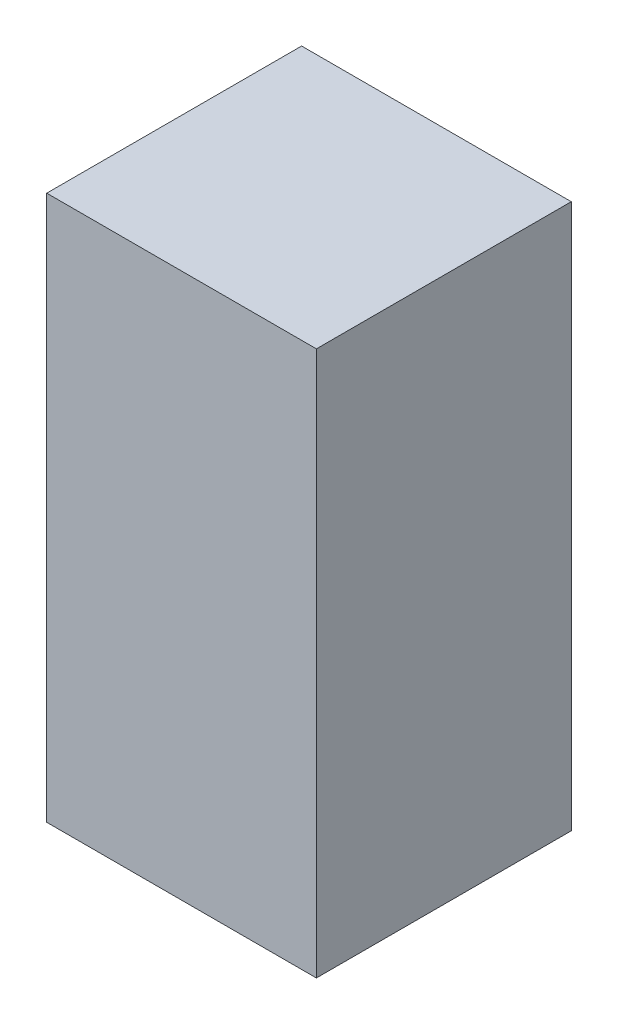
ISO-10303-21;
HEADER;
FILE_DESCRIPTION(('STEP AP214'),'2;1');
FILE_NAME('part.step','',(''),(''),'','','');
FILE_SCHEMA(('AUTOMOTIVE_DESIGN { 1 0 10303 214 1 1 1 1 }'));
ENDSEC;
DATA;
#1=APPLICATION_CONTEXT('core data for automotive mechanical design processes');
#2=APPLICATION_PROTOCOL_DEFINITION('international standard','automotive_design',2000,#1);
#3=PRODUCT_CONTEXT('',#1,'mechanical');
#4=PRODUCT('Part','Part','',(#3));
#5=PRODUCT_RELATED_PRODUCT_CATEGORY('part','',(#4));
#6=PRODUCT_DEFINITION_FORMATION('','',#4);
#7=PRODUCT_DEFINITION_CONTEXT('part definition',#1,'design');
#8=PRODUCT_DEFINITION('design','',#6,#7);
#9=PRODUCT_DEFINITION_SHAPE('','',#8);
#10=(LENGTH_UNIT() NAMED_UNIT(*) SI_UNIT(.MILLI.,.METRE.));
#11=(NAMED_UNIT(*) PLANE_ANGLE_UNIT() SI_UNIT($,.RADIAN.));
#12=(NAMED_UNIT(*) SI_UNIT($,.STERADIAN.) SOLID_ANGLE_UNIT());
#13=UNCERTAINTY_MEASURE_WITH_UNIT(LENGTH_MEASURE(1.E-05),#10,'distance_accuracy_value','');
#14=(GEOMETRIC_REPRESENTATION_CONTEXT(3) GLOBAL_UNCERTAINTY_ASSIGNED_CONTEXT((#13)) GLOBAL_UNIT_ASSIGNED_CONTEXT((#10,
#11,#12)) REPRESENTATION_CONTEXT('',''));
#15=CARTESIAN_POINT('',(0.,0.,0.));
#16=DIRECTION('',(0.,0.,1.));
#17=DIRECTION('',(1.,0.,0.));
#18=AXIS2_PLACEMENT_3D('',#15,#16,#17);
#19=CARTESIAN_POINT('',(0.,74.93,0.));
#20=DIRECTION('',(1.,0.,0.));
#21=DIRECTION('',(0.,0.,-1.));
#22=AXIS2_PLACEMENT_3D('',#19,#20,#21);
#23=PLANE('',#22);
#24=DIRECTION('',(0.,0.,1.));
#25=VECTOR('',#24,1.);
#26=CARTESIAN_POINT('',(0.,0.,0.));
#27=LINE('',#26,#25);
#28=CARTESIAN_POINT('',(0.,0.,-35.052));
#29=VERTEX_POINT('',#28);
#30=CARTESIAN_POINT('',(0.,0.,0.));
#31=VERTEX_POINT('',#30);
#32=EDGE_CURVE('E95',#29,#31,#27,.T.);
#33=ORIENTED_EDGE('',*,*,#32,.T.);
#34=DIRECTION('',(0.,-1.,0.));
#35=VECTOR('',#34,1.);
#36=CARTESIAN_POINT('',(0.,74.93,0.));
#37=LINE('',#36,#35);
#38=CARTESIAN_POINT('',(0.,74.93,0.));
#39=VERTEX_POINT('',#38);
#40=EDGE_CURVE('E11',#39,#31,#37,.T.);
#41=ORIENTED_EDGE('',*,*,#40,.F.);
#42=DIRECTION('',(0.,0.,1.));
#43=VECTOR('',#42,1.);
#44=CARTESIAN_POINT('',(0.,74.93,0.));
#45=LINE('',#44,#43);
#46=CARTESIAN_POINT('',(0.,74.93,-35.052));
#47=VERTEX_POINT('',#46);
#48=EDGE_CURVE('E83',#47,#39,#45,.T.);
#49=ORIENTED_EDGE('',*,*,#48,.F.);
#50=DIRECTION('',(0.,-1.,0.));
#51=VECTOR('',#50,1.);
#52=CARTESIAN_POINT('',(0.,74.93,-35.052));
#53=LINE('',#52,#51);
#54=EDGE_CURVE('E91',#47,#29,#53,.T.);
#55=ORIENTED_EDGE('',*,*,#54,.T.);
#56=EDGE_LOOP('',(#33,#41,#49,#55));
#57=FACE_BOUND('',#56,.T.);
#58=ADVANCED_FACE('F32',(#57),#23,.F.);
#59=CARTESIAN_POINT('',(0.,74.93,0.));
#60=DIRECTION('',(0.,0.,-1.));
#61=DIRECTION('',(-1.,0.,0.));
#62=AXIS2_PLACEMENT_3D('',#59,#60,#61);
#63=PLANE('',#62);
#64=DIRECTION('',(1.,0.,0.));
#65=VECTOR('',#64,1.);
#66=CARTESIAN_POINT('',(0.,0.,0.));
#67=LINE('',#66,#65);
#68=CARTESIAN_POINT('',(37.084,0.,0.));
#69=VERTEX_POINT('',#68);
#70=EDGE_CURVE('E87',#31,#69,#67,.T.);
#71=ORIENTED_EDGE('',*,*,#70,.T.);
#72=DIRECTION('',(0.,-1.,0.));
#73=VECTOR('',#72,1.);
#74=CARTESIAN_POINT('',(37.084,74.93,0.));
#75=LINE('',#74,#73);
#76=CARTESIAN_POINT('',(37.084,74.93,0.));
#77=VERTEX_POINT('',#76);
#78=EDGE_CURVE('E40',#77,#69,#75,.T.);
#79=ORIENTED_EDGE('',*,*,#78,.F.);
#80=DIRECTION('',(1.,0.,0.));
#81=VECTOR('',#80,1.);
#82=CARTESIAN_POINT('',(0.,74.93,0.));
#83=LINE('',#82,#81);
#84=EDGE_CURVE('E78',#39,#77,#83,.T.);
#85=ORIENTED_EDGE('',*,*,#84,.F.);
#86=ORIENTED_EDGE('',*,*,#40,.T.);
#87=EDGE_LOOP('',(#71,#79,#85,#86));
#88=FACE_BOUND('',#87,.T.);
#89=ADVANCED_FACE('F86',(#88),#63,.F.);
#90=CARTESIAN_POINT('',(37.084,74.93,0.));
#91=DIRECTION('',(-1.,0.,0.));
#92=DIRECTION('',(0.,0.,1.));
#93=AXIS2_PLACEMENT_3D('',#90,#91,#92);
#94=PLANE('',#93);
#95=DIRECTION('',(0.,0.,-1.));
#96=VECTOR('',#95,1.);
#97=CARTESIAN_POINT('',(37.084,0.,0.));
#98=LINE('',#97,#96);
#99=CARTESIAN_POINT('',(37.084,0.,-35.052));
#100=VERTEX_POINT('',#99);
#101=EDGE_CURVE('E65',#69,#100,#98,.T.);
#102=ORIENTED_EDGE('',*,*,#101,.T.);
#103=DIRECTION('',(0.,-1.,0.));
#104=VECTOR('',#103,1.);
#105=CARTESIAN_POINT('',(37.084,74.93,-35.052));
#106=LINE('',#105,#104);
#107=CARTESIAN_POINT('',(37.084,74.93,-35.052));
#108=VERTEX_POINT('',#107);
#109=EDGE_CURVE('E88',#108,#100,#106,.T.);
#110=ORIENTED_EDGE('',*,*,#109,.F.);
#111=DIRECTION('',(0.,0.,-1.));
#112=VECTOR('',#111,1.);
#113=CARTESIAN_POINT('',(37.084,74.93,0.));
#114=LINE('',#113,#112);
#115=EDGE_CURVE('E81',#77,#108,#114,.T.);
#116=ORIENTED_EDGE('',*,*,#115,.F.);
#117=ORIENTED_EDGE('',*,*,#78,.T.);
#118=EDGE_LOOP('',(#102,#110,#116,#117));
#119=FACE_BOUND('',#118,.T.);
#120=ADVANCED_FACE('F89',(#119),#94,.F.);
#121=CARTESIAN_POINT('',(0.,74.93,-35.052));
#122=DIRECTION('',(0.,0.,1.));
#123=DIRECTION('',(1.,0.,0.));
#124=AXIS2_PLACEMENT_3D('',#121,#122,#123);
#125=PLANE('',#124);
#126=DIRECTION('',(-1.,0.,0.));
#127=VECTOR('',#126,1.);
#128=CARTESIAN_POINT('',(0.,0.,-35.052));
#129=LINE('',#128,#127);
#130=EDGE_CURVE('E71',#100,#29,#129,.T.);
#131=ORIENTED_EDGE('',*,*,#130,.T.);
#132=ORIENTED_EDGE('',*,*,#54,.F.);
#133=DIRECTION('',(-1.,0.,0.));
#134=VECTOR('',#133,1.);
#135=CARTESIAN_POINT('',(0.,74.93,-35.052));
#136=LINE('',#135,#134);
#137=EDGE_CURVE('E48',#108,#47,#136,.T.);
#138=ORIENTED_EDGE('',*,*,#137,.F.);
#139=ORIENTED_EDGE('',*,*,#109,.T.);
#140=EDGE_LOOP('',(#131,#132,#138,#139));
#141=FACE_BOUND('',#140,.T.);
#142=ADVANCED_FACE('F102',(#141),#125,.F.);
#143=CARTESIAN_POINT('',(0.,74.93,0.));
#144=DIRECTION('',(0.,-1.,0.));
#145=DIRECTION('',(0.,0.,-1.));
#146=AXIS2_PLACEMENT_3D('',#143,#144,#145);
#147=PLANE('',#146);
#148=ORIENTED_EDGE('',*,*,#48,.T.);
#149=ORIENTED_EDGE('',*,*,#84,.T.);
#150=ORIENTED_EDGE('',*,*,#115,.T.);
#151=ORIENTED_EDGE('',*,*,#137,.T.);
#152=EDGE_LOOP('',(#148,#149,#150,#151));
#153=FACE_BOUND('',#152,.T.);
#154=ADVANCED_FACE('F79',(#153),#147,.F.);
#155=CARTESIAN_POINT('',(0.,0.,0.));
#156=DIRECTION('',(0.,-1.,0.));
#157=DIRECTION('',(0.,0.,-1.));
#158=AXIS2_PLACEMENT_3D('',#155,#156,#157);
#159=PLANE('',#158);
#160=ORIENTED_EDGE('',*,*,#32,.F.);
#161=ORIENTED_EDGE('',*,*,#130,.F.);
#162=ORIENTED_EDGE('',*,*,#101,.F.);
#163=ORIENTED_EDGE('',*,*,#70,.F.);
#164=EDGE_LOOP('',(#160,#161,#162,#163));
#165=FACE_BOUND('',#164,.T.);
#166=ADVANCED_FACE('F105',(#165),#159,.T.);
#167=CLOSED_SHELL('',(#58,#89,#120,#142,#154,#166));
#168=MANIFOLD_SOLID_BREP('B2',#167);
#169=ADVANCED_BREP_SHAPE_REPRESENTATION('',(#18,#168),#14);
#170=SHAPE_DEFINITION_REPRESENTATION(#9,#169);
ENDSEC;
END-ISO-10303-21;
